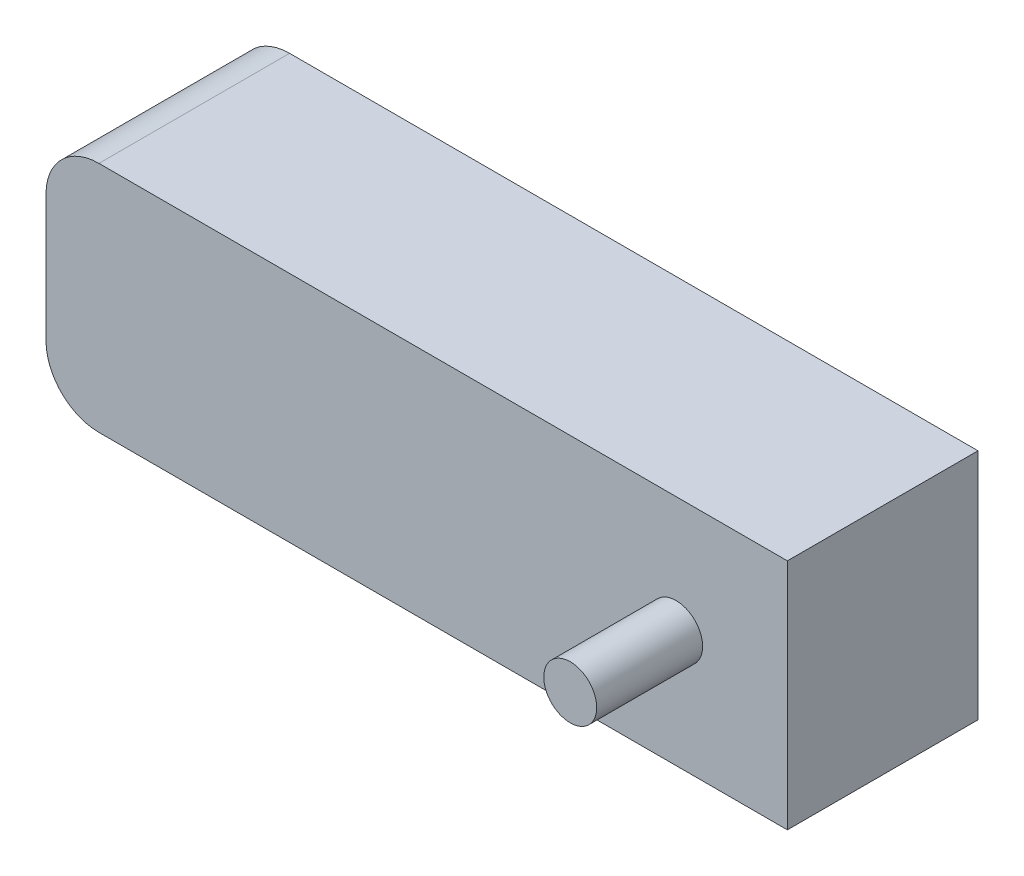
ISO-10303-21;
HEADER;
FILE_DESCRIPTION(('STEP AP214'),'2;1');
FILE_NAME('part.step','',(''),(''),'','','');
FILE_SCHEMA(('AUTOMOTIVE_DESIGN { 1 0 10303 214 1 1 1 1 }'));
ENDSEC;
DATA;
#1=APPLICATION_CONTEXT('core data for automotive mechanical design processes');
#2=APPLICATION_PROTOCOL_DEFINITION('international standard','automotive_design',2000,#1);
#3=PRODUCT_CONTEXT('',#1,'mechanical');
#4=PRODUCT('Part','Part','',(#3));
#5=PRODUCT_RELATED_PRODUCT_CATEGORY('part','',(#4));
#6=PRODUCT_DEFINITION_FORMATION('','',#4);
#7=PRODUCT_DEFINITION_CONTEXT('part definition',#1,'design');
#8=PRODUCT_DEFINITION('design','',#6,#7);
#9=PRODUCT_DEFINITION_SHAPE('','',#8);
#10=(LENGTH_UNIT() NAMED_UNIT(*) SI_UNIT(.MILLI.,.METRE.));
#11=(NAMED_UNIT(*) PLANE_ANGLE_UNIT() SI_UNIT($,.RADIAN.));
#12=(NAMED_UNIT(*) SI_UNIT($,.STERADIAN.) SOLID_ANGLE_UNIT());
#13=UNCERTAINTY_MEASURE_WITH_UNIT(LENGTH_MEASURE(1.E-05),#10,'distance_accuracy_value','');
#14=(GEOMETRIC_REPRESENTATION_CONTEXT(3) GLOBAL_UNCERTAINTY_ASSIGNED_CONTEXT((#13)) GLOBAL_UNIT_ASSIGNED_CONTEXT((#10,
#11,#12)) REPRESENTATION_CONTEXT('',''));
#15=CARTESIAN_POINT('',(0.,0.,0.));
#16=DIRECTION('',(0.,0.,1.));
#17=DIRECTION('',(1.,0.,0.));
#18=AXIS2_PLACEMENT_3D('',#15,#16,#17);
#19=CARTESIAN_POINT('',(0.,0.,18.));
#20=DIRECTION('',(0.,0.,-1.));
#21=DIRECTION('',(-1.,0.,0.));
#22=AXIS2_PLACEMENT_3D('',#19,#20,#21);
#23=PLANE('',#22);
#24=DIRECTION('',(0.,-1.,0.));
#25=VECTOR('',#24,1.);
#26=CARTESIAN_POINT('',(0.,0.,18.));
#27=LINE('',#26,#25);
#28=CARTESIAN_POINT('',(0.,17.,18.));
#29=VERTEX_POINT('',#28);
#30=CARTESIAN_POINT('',(0.,5.,18.));
#31=VERTEX_POINT('',#30);
#32=EDGE_CURVE('E96',#29,#31,#27,.T.);
#33=ORIENTED_EDGE('',*,*,#32,.T.);
#34=CARTESIAN_POINT('',(5.,5.,18.));
#35=DIRECTION('',(0.,0.,-1.));
#36=DIRECTION('',(-1.,0.,0.));
#37=AXIS2_PLACEMENT_3D('',#34,#35,#36);
#38=CIRCLE('',#37,5.);
#39=CARTESIAN_POINT('',(5.,0.,18.));
#40=VERTEX_POINT('',#39);
#41=EDGE_CURVE('E11',#31,#40,#38,.F.);
#42=ORIENTED_EDGE('',*,*,#41,.T.);
#43=DIRECTION('',(1.,0.,0.));
#44=VECTOR('',#43,1.);
#45=CARTESIAN_POINT('',(0.,0.,18.));
#46=LINE('',#45,#44);
#47=CARTESIAN_POINT('',(70.,0.,18.));
#48=VERTEX_POINT('',#47);
#49=EDGE_CURVE('E85',#40,#48,#46,.T.);
#50=ORIENTED_EDGE('',*,*,#49,.T.);
#51=DIRECTION('',(0.,1.,0.));
#52=VECTOR('',#51,1.);
#53=CARTESIAN_POINT('',(70.,0.,18.));
#54=LINE('',#53,#52);
#55=CARTESIAN_POINT('',(70.,22.,18.));
#56=VERTEX_POINT('',#55);
#57=EDGE_CURVE('E90',#48,#56,#54,.T.);
#58=ORIENTED_EDGE('',*,*,#57,.T.);
#59=DIRECTION('',(-1.,0.,0.));
#60=VECTOR('',#59,1.);
#61=CARTESIAN_POINT('',(0.,22.,18.));
#62=LINE('',#61,#60);
#63=CARTESIAN_POINT('',(5.,22.,18.));
#64=VERTEX_POINT('',#63);
#65=EDGE_CURVE('E110',#56,#64,#62,.T.);
#66=ORIENTED_EDGE('',*,*,#65,.T.);
#67=CARTESIAN_POINT('',(5.,17.,18.));
#68=DIRECTION('',(0.,0.,-1.));
#69=DIRECTION('',(-1.,0.,0.));
#70=AXIS2_PLACEMENT_3D('',#67,#68,#69);
#71=CIRCLE('',#70,5.);
#72=EDGE_CURVE('E134',#64,#29,#71,.F.);
#73=ORIENTED_EDGE('',*,*,#72,.T.);
#74=EDGE_LOOP('',(#33,#42,#50,#58,#66,#73));
#75=FACE_BOUND('',#74,.T.);
#76=CARTESIAN_POINT('',(59.5,11.,18.));
#77=DIRECTION('',(0.,0.,-1.));
#78=DIRECTION('',(-1.,0.,0.));
#79=AXIS2_PLACEMENT_3D('',#76,#77,#78);
#80=CIRCLE('',#79,2.5);
#81=CARTESIAN_POINT('',(57.,11.,18.));
#82=VERTEX_POINT('',#81);
#83=EDGE_CURVE('E104',#82,#82,#80,.F.);
#84=ORIENTED_EDGE('',*,*,#83,.F.);
#85=EDGE_LOOP('',(#84));
#86=FACE_BOUND('',#85,.T.);
#87=ADVANCED_FACE('F33',(#75,#86),#23,.F.);
#88=CARTESIAN_POINT('',(0.,0.,18.));
#89=DIRECTION('',(1.,0.,0.));
#90=DIRECTION('',(0.,0.,-1.));
#91=AXIS2_PLACEMENT_3D('',#88,#89,#90);
#92=PLANE('',#91);
#93=DIRECTION('',(0.,-1.,0.));
#94=VECTOR('',#93,1.);
#95=CARTESIAN_POINT('',(0.,0.,0.));
#96=LINE('',#95,#94);
#97=CARTESIAN_POINT('',(0.,17.,0.));
#98=VERTEX_POINT('',#97);
#99=CARTESIAN_POINT('',(0.,5.,0.));
#100=VERTEX_POINT('',#99);
#101=EDGE_CURVE('E115',#98,#100,#96,.T.);
#102=ORIENTED_EDGE('',*,*,#101,.T.);
#103=DIRECTION('',(0.,0.,-1.));
#104=VECTOR('',#103,1.);
#105=CARTESIAN_POINT('',(0.,5.,18.));
#106=LINE('',#105,#104);
#107=EDGE_CURVE('E41',#100,#31,#106,.F.);
#108=ORIENTED_EDGE('',*,*,#107,.T.);
#109=ORIENTED_EDGE('',*,*,#32,.F.);
#110=DIRECTION('',(0.,0.,-1.));
#111=VECTOR('',#110,1.);
#112=CARTESIAN_POINT('',(0.,17.,18.));
#113=LINE('',#112,#111);
#114=EDGE_CURVE('E127',#29,#98,#113,.T.);
#115=ORIENTED_EDGE('',*,*,#114,.T.);
#116=EDGE_LOOP('',(#102,#108,#109,#115));
#117=FACE_BOUND('',#116,.T.);
#118=ADVANCED_FACE('F148',(#117),#92,.F.);
#119=CARTESIAN_POINT('',(0.,0.,18.));
#120=DIRECTION('',(0.,1.,0.));
#121=DIRECTION('',(0.,0.,1.));
#122=AXIS2_PLACEMENT_3D('',#119,#120,#121);
#123=PLANE('',#122);
#124=ORIENTED_EDGE('',*,*,#49,.F.);
#125=DIRECTION('',(0.,0.,-1.));
#126=VECTOR('',#125,1.);
#127=CARTESIAN_POINT('',(5.,0.,18.));
#128=LINE('',#127,#126);
#129=CARTESIAN_POINT('',(5.,0.,0.));
#130=VERTEX_POINT('',#129);
#131=EDGE_CURVE('E136',#40,#130,#128,.T.);
#132=ORIENTED_EDGE('',*,*,#131,.T.);
#133=DIRECTION('',(1.,0.,0.));
#134=VECTOR('',#133,1.);
#135=CARTESIAN_POINT('',(0.,0.,0.));
#136=LINE('',#135,#134);
#137=CARTESIAN_POINT('',(70.,0.,0.));
#138=VERTEX_POINT('',#137);
#139=EDGE_CURVE('E101',#130,#138,#136,.T.);
#140=ORIENTED_EDGE('',*,*,#139,.T.);
#141=DIRECTION('',(0.,0.,-1.));
#142=VECTOR('',#141,1.);
#143=CARTESIAN_POINT('',(70.,0.,18.));
#144=LINE('',#143,#142);
#145=EDGE_CURVE('E99',#48,#138,#144,.T.);
#146=ORIENTED_EDGE('',*,*,#145,.F.);
#147=EDGE_LOOP('',(#124,#132,#140,#146));
#148=FACE_BOUND('',#147,.T.);
#149=ADVANCED_FACE('F100',(#148),#123,.F.);
#150=CARTESIAN_POINT('',(70.,0.,18.));
#151=DIRECTION('',(-1.,0.,0.));
#152=DIRECTION('',(0.,0.,1.));
#153=AXIS2_PLACEMENT_3D('',#150,#151,#152);
#154=PLANE('',#153);
#155=DIRECTION('',(0.,1.,0.));
#156=VECTOR('',#155,1.);
#157=CARTESIAN_POINT('',(70.,0.,0.));
#158=LINE('',#157,#156);
#159=CARTESIAN_POINT('',(70.,22.,0.));
#160=VERTEX_POINT('',#159);
#161=EDGE_CURVE('E119',#138,#160,#158,.T.);
#162=ORIENTED_EDGE('',*,*,#161,.T.);
#163=DIRECTION('',(0.,0.,-1.));
#164=VECTOR('',#163,1.);
#165=CARTESIAN_POINT('',(70.,22.,18.));
#166=LINE('',#165,#164);
#167=EDGE_CURVE('E105',#56,#160,#166,.T.);
#168=ORIENTED_EDGE('',*,*,#167,.F.);
#169=ORIENTED_EDGE('',*,*,#57,.F.);
#170=ORIENTED_EDGE('',*,*,#145,.T.);
#171=EDGE_LOOP('',(#162,#168,#169,#170));
#172=FACE_BOUND('',#171,.T.);
#173=ADVANCED_FACE('F107',(#172),#154,.F.);
#174=CARTESIAN_POINT('',(0.,22.,18.));
#175=DIRECTION('',(0.,-1.,0.));
#176=DIRECTION('',(0.,0.,-1.));
#177=AXIS2_PLACEMENT_3D('',#174,#175,#176);
#178=PLANE('',#177);
#179=DIRECTION('',(-1.,0.,0.));
#180=VECTOR('',#179,1.);
#181=CARTESIAN_POINT('',(0.,22.,0.));
#182=LINE('',#181,#180);
#183=CARTESIAN_POINT('',(5.,22.,0.));
#184=VERTEX_POINT('',#183);
#185=EDGE_CURVE('E121',#160,#184,#182,.T.);
#186=ORIENTED_EDGE('',*,*,#185,.T.);
#187=DIRECTION('',(0.,0.,-1.));
#188=VECTOR('',#187,1.);
#189=CARTESIAN_POINT('',(5.,22.,18.));
#190=LINE('',#189,#188);
#191=EDGE_CURVE('E132',#184,#64,#190,.F.);
#192=ORIENTED_EDGE('',*,*,#191,.T.);
#193=ORIENTED_EDGE('',*,*,#65,.F.);
#194=ORIENTED_EDGE('',*,*,#167,.T.);
#195=EDGE_LOOP('',(#186,#192,#193,#194));
#196=FACE_BOUND('',#195,.T.);
#197=ADVANCED_FACE('F142',(#196),#178,.F.);
#198=CARTESIAN_POINT('',(0.,0.,0.));
#199=DIRECTION('',(0.,0.,-1.));
#200=DIRECTION('',(-1.,0.,0.));
#201=AXIS2_PLACEMENT_3D('',#198,#199,#200);
#202=PLANE('',#201);
#203=ORIENTED_EDGE('',*,*,#139,.F.);
#204=CARTESIAN_POINT('',(5.,5.,0.));
#205=DIRECTION('',(0.,0.,-1.));
#206=DIRECTION('',(-1.,0.,0.));
#207=AXIS2_PLACEMENT_3D('',#204,#205,#206);
#208=CIRCLE('',#207,5.);
#209=EDGE_CURVE('E55',#130,#100,#208,.T.);
#210=ORIENTED_EDGE('',*,*,#209,.T.);
#211=ORIENTED_EDGE('',*,*,#101,.F.);
#212=CARTESIAN_POINT('',(5.,17.,0.));
#213=DIRECTION('',(0.,0.,-1.));
#214=DIRECTION('',(-1.,0.,0.));
#215=AXIS2_PLACEMENT_3D('',#212,#213,#214);
#216=CIRCLE('',#215,5.);
#217=EDGE_CURVE('E130',#98,#184,#216,.T.);
#218=ORIENTED_EDGE('',*,*,#217,.T.);
#219=ORIENTED_EDGE('',*,*,#185,.F.);
#220=ORIENTED_EDGE('',*,*,#161,.F.);
#221=EDGE_LOOP('',(#203,#210,#211,#218,#219,#220));
#222=FACE_BOUND('',#221,.T.);
#223=ADVANCED_FACE('F139',(#222),#202,.T.);
#224=CARTESIAN_POINT('',(59.5,11.,28.));
#225=DIRECTION('',(0.,0.,-1.));
#226=DIRECTION('',(-1.,0.,0.));
#227=AXIS2_PLACEMENT_3D('',#224,#225,#226);
#228=CYLINDRICAL_SURFACE('',#227,2.5);
#229=CARTESIAN_POINT('',(59.5,11.,28.));
#230=DIRECTION('',(0.,0.,1.));
#231=DIRECTION('',(1.,0.,0.));
#232=AXIS2_PLACEMENT_3D('',#229,#230,#231);
#233=CIRCLE('',#232,2.5);
#234=CARTESIAN_POINT('',(62.,11.,28.));
#235=VERTEX_POINT('',#234);
#236=EDGE_CURVE('E117',#235,#235,#233,.T.);
#237=ORIENTED_EDGE('',*,*,#236,.F.);
#238=EDGE_LOOP('',(#237));
#239=FACE_BOUND('',#238,.T.);
#240=ORIENTED_EDGE('',*,*,#83,.T.);
#241=EDGE_LOOP('',(#240));
#242=FACE_BOUND('',#241,.T.);
#243=ADVANCED_FACE('F155',(#239,#242),#228,.T.);
#244=CARTESIAN_POINT('',(59.5,11.,28.));
#245=DIRECTION('',(0.,0.,1.));
#246=DIRECTION('',(1.,0.,0.));
#247=AXIS2_PLACEMENT_3D('',#244,#245,#246);
#248=PLANE('',#247);
#249=ORIENTED_EDGE('',*,*,#236,.T.);
#250=EDGE_LOOP('',(#249));
#251=FACE_BOUND('',#250,.T.);
#252=ADVANCED_FACE('F153',(#251),#248,.T.);
#253=CARTESIAN_POINT('',(5.,17.,18.));
#254=DIRECTION('',(0.,0.,-1.));
#255=DIRECTION('',(-1.,0.,0.));
#256=AXIS2_PLACEMENT_3D('',#253,#254,#255);
#257=CYLINDRICAL_SURFACE('',#256,5.);
#258=ORIENTED_EDGE('',*,*,#72,.F.);
#259=ORIENTED_EDGE('',*,*,#191,.F.);
#260=ORIENTED_EDGE('',*,*,#217,.F.);
#261=ORIENTED_EDGE('',*,*,#114,.F.);
#262=EDGE_LOOP('',(#258,#259,#260,#261));
#263=FACE_BOUND('',#262,.T.);
#264=ADVANCED_FACE('F147',(#263),#257,.T.);
#265=CARTESIAN_POINT('',(5.,5.,18.));
#266=DIRECTION('',(0.,0.,-1.));
#267=DIRECTION('',(-1.,0.,0.));
#268=AXIS2_PLACEMENT_3D('',#265,#266,#267);
#269=CYLINDRICAL_SURFACE('',#268,5.);
#270=ORIENTED_EDGE('',*,*,#41,.F.);
#271=ORIENTED_EDGE('',*,*,#107,.F.);
#272=ORIENTED_EDGE('',*,*,#209,.F.);
#273=ORIENTED_EDGE('',*,*,#131,.F.);
#274=EDGE_LOOP('',(#270,#271,#272,#273));
#275=FACE_BOUND('',#274,.T.);
#276=ADVANCED_FACE('F35',(#275),#269,.T.);
#277=CLOSED_SHELL('',(#87,#118,#149,#173,#197,#223,#243,#252,#264,#276));
#278=MANIFOLD_SOLID_BREP('B2',#277);
#279=ADVANCED_BREP_SHAPE_REPRESENTATION('',(#18,#278),#14);
#280=SHAPE_DEFINITION_REPRESENTATION(#9,#279);
ENDSEC;
END-ISO-10303-21;
